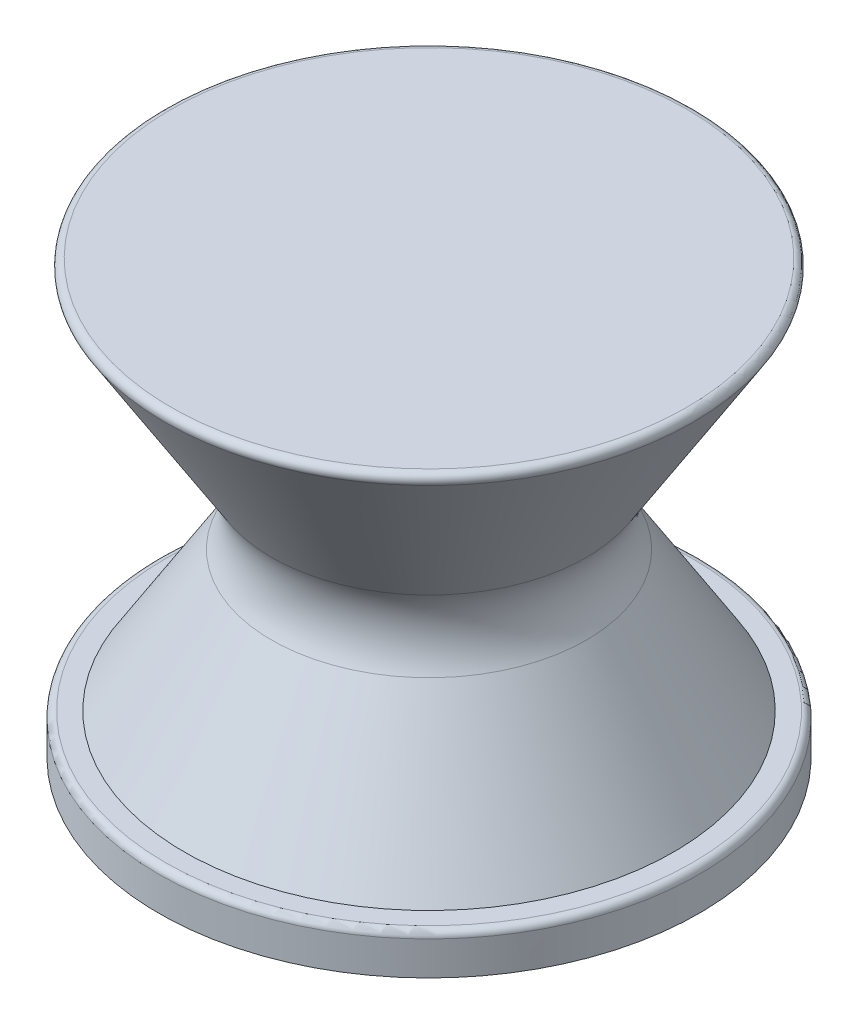
ISO-10303-21;
HEADER;
FILE_DESCRIPTION(('STEP AP214'),'2;1');
FILE_NAME('part.step','',(''),(''),'','','');
FILE_SCHEMA(('AUTOMOTIVE_DESIGN { 1 0 10303 214 1 1 1 1 }'));
ENDSEC;
DATA;
#1=APPLICATION_CONTEXT('core data for automotive mechanical design processes');
#2=APPLICATION_PROTOCOL_DEFINITION('international standard','automotive_design',2000,#1);
#3=PRODUCT_CONTEXT('',#1,'mechanical');
#4=PRODUCT('Part','Part','',(#3));
#5=PRODUCT_RELATED_PRODUCT_CATEGORY('part','',(#4));
#6=PRODUCT_DEFINITION_FORMATION('','',#4);
#7=PRODUCT_DEFINITION_CONTEXT('part definition',#1,'design');
#8=PRODUCT_DEFINITION('design','',#6,#7);
#9=PRODUCT_DEFINITION_SHAPE('','',#8);
#10=(LENGTH_UNIT() NAMED_UNIT(*) SI_UNIT(.MILLI.,.METRE.));
#11=(NAMED_UNIT(*) PLANE_ANGLE_UNIT() SI_UNIT($,.RADIAN.));
#12=(NAMED_UNIT(*) SI_UNIT($,.STERADIAN.) SOLID_ANGLE_UNIT());
#13=UNCERTAINTY_MEASURE_WITH_UNIT(LENGTH_MEASURE(1.E-05),#10,'distance_accuracy_value','');
#14=(GEOMETRIC_REPRESENTATION_CONTEXT(3) GLOBAL_UNCERTAINTY_ASSIGNED_CONTEXT((#13)) GLOBAL_UNIT_ASSIGNED_CONTEXT((#10,
#11,#12)) REPRESENTATION_CONTEXT('',''));
#15=CARTESIAN_POINT('',(0.,0.,0.));
#16=DIRECTION('',(0.,0.,1.));
#17=DIRECTION('',(1.,0.,0.));
#18=AXIS2_PLACEMENT_3D('',#15,#16,#17);
#19=CARTESIAN_POINT('',(0.,0.,0.));
#20=DIRECTION('',(0.,1.,0.));
#21=DIRECTION('',(0.,0.,1.));
#22=AXIS2_PLACEMENT_3D('',#19,#20,#21);
#23=PLANE('',#22);
#24=CARTESIAN_POINT('',(0.,0.,0.));
#25=DIRECTION('',(0.,-1.,0.));
#26=DIRECTION('',(0.,0.,-1.));
#27=AXIS2_PLACEMENT_3D('',#24,#25,#26);
#28=CIRCLE('',#27,20.);
#29=CARTESIAN_POINT('',(0.,0.,-20.));
#30=VERTEX_POINT('',#29);
#31=EDGE_CURVE('E59',#30,#30,#28,.T.);
#32=ORIENTED_EDGE('',*,*,#31,.T.);
#33=EDGE_LOOP('',(#32));
#34=FACE_BOUND('',#33,.T.);
#35=ADVANCED_FACE('F33',(#34),#23,.F.);
#36=CARTESIAN_POINT('',(0.,0.,0.));
#37=DIRECTION('',(0.,-1.,0.));
#38=DIRECTION('',(0.,0.,-1.));
#39=AXIS2_PLACEMENT_3D('',#36,#37,#38);
#40=CYLINDRICAL_SURFACE('',#39,20.);
#41=CARTESIAN_POINT('',(0.,2.5,0.));
#42=DIRECTION('',(0.,1.,0.));
#43=DIRECTION('',(0.,0.,1.));
#44=AXIS2_PLACEMENT_3D('',#41,#42,#43);
#45=CIRCLE('',#44,20.);
#46=CARTESIAN_POINT('',(0.,2.5,20.));
#47=VERTEX_POINT('',#46);
#48=EDGE_CURVE('E40',#47,#47,#45,.F.);
#49=ORIENTED_EDGE('',*,*,#48,.T.);
#50=EDGE_LOOP('',(#49));
#51=FACE_BOUND('',#50,.T.);
#52=ORIENTED_EDGE('',*,*,#31,.F.);
#53=EDGE_LOOP('',(#52));
#54=FACE_BOUND('',#53,.T.);
#55=ADVANCED_FACE('F80',(#51,#54),#40,.T.);
#56=CARTESIAN_POINT('',(0.,3.,0.));
#57=DIRECTION('',(0.,1.,0.));
#58=DIRECTION('',(0.,0.,1.));
#59=AXIS2_PLACEMENT_3D('',#56,#57,#58);
#60=PLANE('',#59);
#61=CARTESIAN_POINT('',(0.,3.,0.));
#62=DIRECTION('',(0.,1.,0.));
#63=DIRECTION('',(0.,0.,1.));
#64=AXIS2_PLACEMENT_3D('',#61,#62,#63);
#65=CIRCLE('',#64,19.5);
#66=CARTESIAN_POINT('',(0.,3.,19.5));
#67=VERTEX_POINT('',#66);
#68=EDGE_CURVE('E10',#67,#67,#65,.T.);
#69=ORIENTED_EDGE('',*,*,#68,.T.);
#70=EDGE_LOOP('',(#69));
#71=FACE_BOUND('',#70,.T.);
#72=CARTESIAN_POINT('',(0.,3.,0.));
#73=DIRECTION('',(0.,-1.,0.));
#74=DIRECTION('',(0.,0.,-1.));
#75=AXIS2_PLACEMENT_3D('',#72,#73,#74);
#76=CIRCLE('',#75,18.125);
#77=CARTESIAN_POINT('',(0.,3.,-18.125));
#78=VERTEX_POINT('',#77);
#79=EDGE_CURVE('E62',#78,#78,#76,.T.);
#80=ORIENTED_EDGE('',*,*,#79,.T.);
#81=EDGE_LOOP('',(#80));
#82=FACE_BOUND('',#81,.T.);
#83=ADVANCED_FACE('F66',(#71,#82),#60,.T.);
#84=CARTESIAN_POINT('',(0.,16.,0.));
#85=DIRECTION('',(0.,-1.,0.));
#86=DIRECTION('',(0.,0.,-1.));
#87=AXIS2_PLACEMENT_3D('',#84,#85,#86);
#88=CONICAL_SURFACE('',#87,10.,0.558599315343563);
#89=CARTESIAN_POINT('',(0.,13.3500052999841,0.));
#90=DIRECTION('',(0.,-1.,0.));
#91=DIRECTION('',(0.,0.,-1.));
#92=AXIS2_PLACEMENT_3D('',#89,#90,#91);
#93=CIRCLE('',#92,11.6562466875099);
#94=CARTESIAN_POINT('',(0.,13.3500052999841,-11.6562466875099));
#95=VERTEX_POINT('',#94);
#96=EDGE_CURVE('E56',#95,#95,#93,.T.);
#97=ORIENTED_EDGE('',*,*,#96,.T.);
#98=EDGE_LOOP('',(#97));
#99=FACE_BOUND('',#98,.T.);
#100=ORIENTED_EDGE('',*,*,#79,.F.);
#101=EDGE_LOOP('',(#100));
#102=FACE_BOUND('',#101,.T.);
#103=ADVANCED_FACE('F68',(#99,#102),#88,.T.);
#104=CARTESIAN_POINT('',(0.,32.,0.));
#105=DIRECTION('',(0.,1.,0.));
#106=DIRECTION('',(0.,0.,1.));
#107=AXIS2_PLACEMENT_3D('',#104,#105,#106);
#108=CONICAL_SURFACE('',#107,20.,0.558599315343562);
#109=CARTESIAN_POINT('',(0.,31.2350005299984,0.));
#110=DIRECTION('',(0.,-1.,0.));
#111=DIRECTION('',(0.,0.,-1.));
#112=AXIS2_PLACEMENT_3D('',#109,#110,#111);
#113=CIRCLE('',#112,19.521875331249);
#114=CARTESIAN_POINT('',(0.,31.2350005299984,-19.521875331249));
#115=VERTEX_POINT('',#114);
#116=EDGE_CURVE('E48',#115,#115,#113,.T.);
#117=ORIENTED_EDGE('',*,*,#116,.T.);
#118=EDGE_LOOP('',(#117));
#119=FACE_BOUND('',#118,.T.);
#120=CARTESIAN_POINT('',(0.,18.6499947000159,0.));
#121=DIRECTION('',(0.,1.,0.));
#122=DIRECTION('',(0.,0.,1.));
#123=AXIS2_PLACEMENT_3D('',#120,#121,#122);
#124=CIRCLE('',#123,11.6562466875099);
#125=CARTESIAN_POINT('',(0.,18.6499947000159,11.6562466875099));
#126=VERTEX_POINT('',#125);
#127=EDGE_CURVE('E53',#126,#126,#124,.T.);
#128=ORIENTED_EDGE('',*,*,#127,.T.);
#129=EDGE_LOOP('',(#128));
#130=FACE_BOUND('',#129,.T.);
#131=ADVANCED_FACE('F70',(#119,#130),#108,.T.);
#132=CARTESIAN_POINT('',(0.,32.,0.));
#133=DIRECTION('',(0.,-1.,0.));
#134=DIRECTION('',(0.,0.,-1.));
#135=AXIS2_PLACEMENT_3D('',#132,#133,#134);
#136=PLANE('',#135);
#137=CARTESIAN_POINT('',(0.,32.,0.));
#138=DIRECTION('',(0.,-1.,0.));
#139=DIRECTION('',(0.,0.,-1.));
#140=AXIS2_PLACEMENT_3D('',#137,#138,#139);
#141=CIRCLE('',#140,19.0978761792465);
#142=CARTESIAN_POINT('',(0.,32.,-19.0978761792465));
#143=VERTEX_POINT('',#142);
#144=EDGE_CURVE('E44',#143,#143,#141,.F.);
#145=ORIENTED_EDGE('',*,*,#144,.T.);
#146=EDGE_LOOP('',(#145));
#147=FACE_BOUND('',#146,.T.);
#148=ADVANCED_FACE('F77',(#147),#136,.F.);
#149=CARTESIAN_POINT('',(0.,16.,0.));
#150=DIRECTION('',(0.,-1.,0.));
#151=DIRECTION('',(0.,0.,-1.));
#152=AXIS2_PLACEMENT_3D('',#149,#150,#151);
#153=TOROIDAL_SURFACE('',#152,15.8962382075354,5.);
#154=ORIENTED_EDGE('',*,*,#127,.F.);
#155=EDGE_LOOP('',(#154));
#156=FACE_BOUND('',#155,.T.);
#157=ORIENTED_EDGE('',*,*,#96,.F.);
#158=EDGE_LOOP('',(#157));
#159=FACE_BOUND('',#158,.T.);
#160=ADVANCED_FACE('F90',(#156,#159),#153,.F.);
#161=CARTESIAN_POINT('',(0.,31.5,0.));
#162=DIRECTION('',(0.,-1.,0.));
#163=DIRECTION('',(0.,0.,-1.));
#164=AXIS2_PLACEMENT_3D('',#161,#162,#163);
#165=TOROIDAL_SURFACE('',#164,19.0978761792465,0.5);
#166=ORIENTED_EDGE('',*,*,#144,.F.);
#167=EDGE_LOOP('',(#166));
#168=FACE_BOUND('',#167,.T.);
#169=ORIENTED_EDGE('',*,*,#116,.F.);
#170=EDGE_LOOP('',(#169));
#171=FACE_BOUND('',#170,.T.);
#172=ADVANCED_FACE('F92',(#168,#171),#165,.T.);
#173=CARTESIAN_POINT('',(0.,2.5,0.));
#174=DIRECTION('',(0.,1.,0.));
#175=DIRECTION('',(0.,0.,1.));
#176=AXIS2_PLACEMENT_3D('',#173,#174,#175);
#177=TOROIDAL_SURFACE('',#176,19.5,0.5);
#178=ORIENTED_EDGE('',*,*,#68,.F.);
#179=EDGE_LOOP('',(#178));
#180=FACE_BOUND('',#179,.T.);
#181=ORIENTED_EDGE('',*,*,#48,.F.);
#182=EDGE_LOOP('',(#181));
#183=FACE_BOUND('',#182,.T.);
#184=ADVANCED_FACE('F35',(#180,#183),#177,.T.);
#185=CLOSED_SHELL('',(#35,#55,#83,#103,#131,#148,#160,#172,#184));
#186=MANIFOLD_SOLID_BREP('B2',#185);
#187=ADVANCED_BREP_SHAPE_REPRESENTATION('',(#18,#186),#14);
#188=SHAPE_DEFINITION_REPRESENTATION(#9,#187);
ENDSEC;
END-ISO-10303-21;
